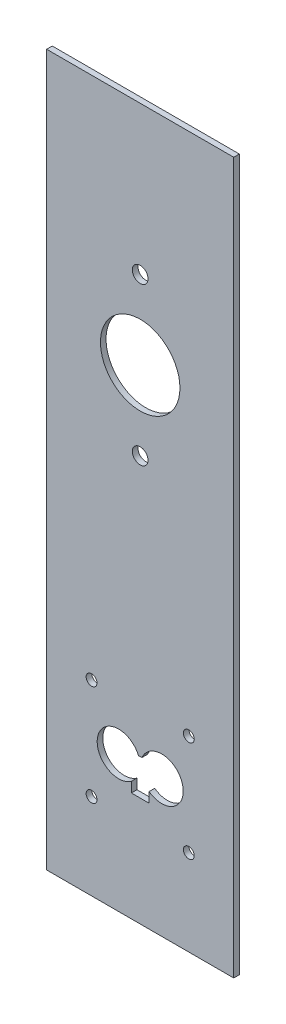
ISO-10303-21;
HEADER;
FILE_DESCRIPTION(('STEP AP214'),'2;1');
FILE_NAME('part.step','',(''),(''),'','','');
FILE_SCHEMA(('AUTOMOTIVE_DESIGN { 1 0 10303 214 1 1 1 1 }'));
ENDSEC;
DATA;
#1=APPLICATION_CONTEXT('core data for automotive mechanical design processes');
#2=APPLICATION_PROTOCOL_DEFINITION('international standard','automotive_design',2000,#1);
#3=PRODUCT_CONTEXT('',#1,'mechanical');
#4=PRODUCT('Part','Part','',(#3));
#5=PRODUCT_RELATED_PRODUCT_CATEGORY('part','',(#4));
#6=PRODUCT_DEFINITION_FORMATION('','',#4);
#7=PRODUCT_DEFINITION_CONTEXT('part definition',#1,'design');
#8=PRODUCT_DEFINITION('design','',#6,#7);
#9=PRODUCT_DEFINITION_SHAPE('','',#8);
#10=(LENGTH_UNIT() NAMED_UNIT(*) SI_UNIT(.MILLI.,.METRE.));
#11=(NAMED_UNIT(*) PLANE_ANGLE_UNIT() SI_UNIT($,.RADIAN.));
#12=(NAMED_UNIT(*) SI_UNIT($,.STERADIAN.) SOLID_ANGLE_UNIT());
#13=UNCERTAINTY_MEASURE_WITH_UNIT(LENGTH_MEASURE(1.E-05),#10,'distance_accuracy_value','');
#14=(GEOMETRIC_REPRESENTATION_CONTEXT(3) GLOBAL_UNCERTAINTY_ASSIGNED_CONTEXT((#13)) GLOBAL_UNIT_ASSIGNED_CONTEXT((#10,
#11,#12)) REPRESENTATION_CONTEXT('',''));
#15=CARTESIAN_POINT('',(0.,0.,0.));
#16=DIRECTION('',(0.,0.,1.));
#17=DIRECTION('',(1.,0.,0.));
#18=AXIS2_PLACEMENT_3D('',#15,#16,#17);
#19=CARTESIAN_POINT('',(0.,0.,-3.));
#20=DIRECTION('',(0.,-1.,0.));
#21=DIRECTION('',(0.,0.,-1.));
#22=AXIS2_PLACEMENT_3D('',#19,#20,#21);
#23=PLANE('',#22);
#24=DIRECTION('',(1.,0.,0.));
#25=VECTOR('',#24,1.);
#26=CARTESIAN_POINT('',(0.,0.,0.));
#27=LINE('',#26,#25);
#28=CARTESIAN_POINT('',(0.,0.,0.));
#29=VERTEX_POINT('',#28);
#30=CARTESIAN_POINT('',(100.,0.,0.));
#31=VERTEX_POINT('',#30);
#32=EDGE_CURVE('E187',#29,#31,#27,.T.);
#33=ORIENTED_EDGE('',*,*,#32,.F.);
#34=DIRECTION('',(0.,0.,1.));
#35=VECTOR('',#34,1.);
#36=CARTESIAN_POINT('',(0.,0.,-3.));
#37=LINE('',#36,#35);
#38=CARTESIAN_POINT('',(0.,0.,-3.));
#39=VERTEX_POINT('',#38);
#40=EDGE_CURVE('E12',#39,#29,#37,.T.);
#41=ORIENTED_EDGE('',*,*,#40,.F.);
#42=DIRECTION('',(1.,0.,0.));
#43=VECTOR('',#42,1.);
#44=CARTESIAN_POINT('',(0.,0.,-3.));
#45=LINE('',#44,#43);
#46=CARTESIAN_POINT('',(100.,0.,-3.));
#47=VERTEX_POINT('',#46);
#48=EDGE_CURVE('E203',#39,#47,#45,.T.);
#49=ORIENTED_EDGE('',*,*,#48,.T.);
#50=DIRECTION('',(0.,0.,1.));
#51=VECTOR('',#50,1.);
#52=CARTESIAN_POINT('',(100.,0.,-3.));
#53=LINE('',#52,#51);
#54=EDGE_CURVE('E40',#47,#31,#53,.T.);
#55=ORIENTED_EDGE('',*,*,#54,.T.);
#56=EDGE_LOOP('',(#33,#41,#49,#55));
#57=FACE_BOUND('',#56,.T.);
#58=ADVANCED_FACE('F37',(#57),#23,.T.);
#59=CARTESIAN_POINT('',(0.,0.,-3.));
#60=DIRECTION('',(1.,0.,0.));
#61=DIRECTION('',(0.,0.,-1.));
#62=AXIS2_PLACEMENT_3D('',#59,#60,#61);
#63=PLANE('',#62);
#64=DIRECTION('',(0.,1.,0.));
#65=VECTOR('',#64,1.);
#66=CARTESIAN_POINT('',(0.,0.,0.));
#67=LINE('',#66,#65);
#68=CARTESIAN_POINT('',(0.,380.,0.));
#69=VERTEX_POINT('',#68);
#70=EDGE_CURVE('E201',#29,#69,#67,.T.);
#71=ORIENTED_EDGE('',*,*,#70,.T.);
#72=DIRECTION('',(0.,0.,1.));
#73=VECTOR('',#72,1.);
#74=CARTESIAN_POINT('',(0.,380.,-3.));
#75=LINE('',#74,#73);
#76=CARTESIAN_POINT('',(0.,380.,-3.));
#77=VERTEX_POINT('',#76);
#78=EDGE_CURVE('E45',#77,#69,#75,.T.);
#79=ORIENTED_EDGE('',*,*,#78,.F.);
#80=DIRECTION('',(0.,1.,0.));
#81=VECTOR('',#80,1.);
#82=CARTESIAN_POINT('',(0.,0.,-3.));
#83=LINE('',#82,#81);
#84=EDGE_CURVE('E193',#39,#77,#83,.T.);
#85=ORIENTED_EDGE('',*,*,#84,.F.);
#86=ORIENTED_EDGE('',*,*,#40,.T.);
#87=EDGE_LOOP('',(#71,#79,#85,#86));
#88=FACE_BOUND('',#87,.T.);
#89=ADVANCED_FACE('F277',(#88),#63,.F.);
#90=CARTESIAN_POINT('',(0.,380.,-3.));
#91=DIRECTION('',(0.,-1.,0.));
#92=DIRECTION('',(0.,0.,-1.));
#93=AXIS2_PLACEMENT_3D('',#90,#91,#92);
#94=PLANE('',#93);
#95=DIRECTION('',(1.,0.,0.));
#96=VECTOR('',#95,1.);
#97=CARTESIAN_POINT('',(0.,380.,0.));
#98=LINE('',#97,#96);
#99=CARTESIAN_POINT('',(100.,380.,0.));
#100=VERTEX_POINT('',#99);
#101=EDGE_CURVE('E198',#69,#100,#98,.T.);
#102=ORIENTED_EDGE('',*,*,#101,.T.);
#103=DIRECTION('',(0.,0.,1.));
#104=VECTOR('',#103,1.);
#105=CARTESIAN_POINT('',(100.,380.,-3.));
#106=LINE('',#105,#104);
#107=CARTESIAN_POINT('',(100.,380.,-3.));
#108=VERTEX_POINT('',#107);
#109=EDGE_CURVE('E206',#108,#100,#106,.T.);
#110=ORIENTED_EDGE('',*,*,#109,.F.);
#111=DIRECTION('',(1.,0.,0.));
#112=VECTOR('',#111,1.);
#113=CARTESIAN_POINT('',(0.,380.,-3.));
#114=LINE('',#113,#112);
#115=EDGE_CURVE('E214',#77,#108,#114,.T.);
#116=ORIENTED_EDGE('',*,*,#115,.F.);
#117=ORIENTED_EDGE('',*,*,#78,.T.);
#118=EDGE_LOOP('',(#102,#110,#116,#117));
#119=FACE_BOUND('',#118,.T.);
#120=ADVANCED_FACE('F281',(#119),#94,.F.);
#121=CARTESIAN_POINT('',(100.,0.,-3.));
#122=DIRECTION('',(1.,0.,0.));
#123=DIRECTION('',(0.,0.,-1.));
#124=AXIS2_PLACEMENT_3D('',#121,#122,#123);
#125=PLANE('',#124);
#126=DIRECTION('',(0.,1.,0.));
#127=VECTOR('',#126,1.);
#128=CARTESIAN_POINT('',(100.,0.,0.));
#129=LINE('',#128,#127);
#130=EDGE_CURVE('E191',#31,#100,#129,.T.);
#131=ORIENTED_EDGE('',*,*,#130,.F.);
#132=ORIENTED_EDGE('',*,*,#54,.F.);
#133=DIRECTION('',(0.,1.,0.));
#134=VECTOR('',#133,1.);
#135=CARTESIAN_POINT('',(100.,0.,-3.));
#136=LINE('',#135,#134);
#137=EDGE_CURVE('E219',#47,#108,#136,.T.);
#138=ORIENTED_EDGE('',*,*,#137,.T.);
#139=ORIENTED_EDGE('',*,*,#109,.T.);
#140=EDGE_LOOP('',(#131,#132,#138,#139));
#141=FACE_BOUND('',#140,.T.);
#142=ADVANCED_FACE('F288',(#141),#125,.T.);
#143=CARTESIAN_POINT('',(0.,0.,-3.));
#144=DIRECTION('',(0.,0.,1.));
#145=DIRECTION('',(1.,0.,0.));
#146=AXIS2_PLACEMENT_3D('',#143,#144,#145);
#147=PLANE('',#146);
#148=CARTESIAN_POINT('',(50.,300.75,-3.));
#149=DIRECTION('',(0.,0.,1.));
#150=DIRECTION('',(1.,0.,0.));
#151=AXIS2_PLACEMENT_3D('',#148,#149,#150);
#152=CIRCLE('',#151,4.19999999999996);
#153=CARTESIAN_POINT('',(54.2,300.75,-3.));
#154=VERTEX_POINT('',#153);
#155=EDGE_CURVE('E192',#154,#154,#152,.T.);
#156=ORIENTED_EDGE('',*,*,#155,.T.);
#157=EDGE_LOOP('',(#156));
#158=FACE_BOUND('',#157,.T.);
#159=DIRECTION('',(1.,0.,0.));
#160=VECTOR('',#159,1.);
#161=CARTESIAN_POINT('',(0.,58.3000000000001,-3.));
#162=LINE('',#161,#160);
#163=CARTESIAN_POINT('',(45.25,58.3,-3.));
#164=VERTEX_POINT('',#163);
#165=CARTESIAN_POINT('',(54.75,58.3000000000001,-3.));
#166=VERTEX_POINT('',#165);
#167=EDGE_CURVE('E228',#164,#166,#162,.T.);
#168=ORIENTED_EDGE('',*,*,#167,.T.);
#169=DIRECTION('',(0.,1.,0.));
#170=VECTOR('',#169,1.);
#171=CARTESIAN_POINT('',(54.75,0.,-3.));
#172=LINE('',#171,#170);
#173=CARTESIAN_POINT('',(54.75,63.689387775232,-3.));
#174=VERTEX_POINT('',#173);
#175=EDGE_CURVE('E117',#166,#174,#172,.T.);
#176=ORIENTED_EDGE('',*,*,#175,.T.);
#177=CARTESIAN_POINT('',(61.5,73.,-3.));
#178=DIRECTION('',(0.,0.,1.));
#179=DIRECTION('',(1.,0.,0.));
#180=AXIS2_PLACEMENT_3D('',#177,#178,#179);
#181=CIRCLE('',#180,11.5);
#182=CARTESIAN_POINT('',(50.9169947557416,77.5,-3.));
#183=VERTEX_POINT('',#182);
#184=EDGE_CURVE('E237',#174,#183,#181,.T.);
#185=ORIENTED_EDGE('',*,*,#184,.T.);
#186=DIRECTION('',(1.,0.,0.));
#187=VECTOR('',#186,1.);
#188=CARTESIAN_POINT('',(0.,77.5,-3.));
#189=LINE('',#188,#187);
#190=CARTESIAN_POINT('',(49.0830052442583,77.5,-3.));
#191=VERTEX_POINT('',#190);
#192=EDGE_CURVE('E235',#191,#183,#189,.T.);
#193=ORIENTED_EDGE('',*,*,#192,.F.);
#194=CARTESIAN_POINT('',(38.5,73.,-3.));
#195=DIRECTION('',(0.,0.,1.));
#196=DIRECTION('',(1.,0.,0.));
#197=AXIS2_PLACEMENT_3D('',#194,#195,#196);
#198=CIRCLE('',#197,11.5);
#199=CARTESIAN_POINT('',(45.25,63.6893877752321,-3.));
#200=VERTEX_POINT('',#199);
#201=EDGE_CURVE('E232',#191,#200,#198,.T.);
#202=ORIENTED_EDGE('',*,*,#201,.T.);
#203=DIRECTION('',(0.,1.,0.));
#204=VECTOR('',#203,1.);
#205=CARTESIAN_POINT('',(45.25,0.,-3.));
#206=LINE('',#205,#204);
#207=EDGE_CURVE('E230',#164,#200,#206,.T.);
#208=ORIENTED_EDGE('',*,*,#207,.F.);
#209=EDGE_LOOP('',(#168,#176,#185,#193,#202,#208));
#210=FACE_BOUND('',#209,.T.);
#211=CARTESIAN_POINT('',(24.,46.0000000000001,-3.));
#212=DIRECTION('',(0.,0.,1.));
#213=DIRECTION('',(1.,0.,0.));
#214=AXIS2_PLACEMENT_3D('',#211,#212,#213);
#215=CIRCLE('',#214,2.89999999999997);
#216=CARTESIAN_POINT('',(26.9,46.0000000000001,-3.));
#217=VERTEX_POINT('',#216);
#218=EDGE_CURVE('E240',#217,#217,#215,.T.);
#219=ORIENTED_EDGE('',*,*,#218,.T.);
#220=EDGE_LOOP('',(#219));
#221=FACE_BOUND('',#220,.T.);
#222=CARTESIAN_POINT('',(76.,100.,-3.));
#223=DIRECTION('',(0.,0.,1.));
#224=DIRECTION('',(1.,0.,0.));
#225=AXIS2_PLACEMENT_3D('',#222,#223,#224);
#226=CIRCLE('',#225,2.89999999999999);
#227=CARTESIAN_POINT('',(78.9,100.,-3.));
#228=VERTEX_POINT('',#227);
#229=EDGE_CURVE('E243',#228,#228,#226,.T.);
#230=ORIENTED_EDGE('',*,*,#229,.T.);
#231=EDGE_LOOP('',(#230));
#232=FACE_BOUND('',#231,.T.);
#233=CARTESIAN_POINT('',(50.,258.75,-3.));
#234=DIRECTION('',(0.,0.,1.));
#235=DIRECTION('',(1.,0.,0.));
#236=AXIS2_PLACEMENT_3D('',#233,#234,#235);
#237=CIRCLE('',#236,21.25);
#238=CARTESIAN_POINT('',(71.25,258.75,-3.));
#239=VERTEX_POINT('',#238);
#240=EDGE_CURVE('E246',#239,#239,#237,.T.);
#241=ORIENTED_EDGE('',*,*,#240,.T.);
#242=EDGE_LOOP('',(#241));
#243=FACE_BOUND('',#242,.T.);
#244=CARTESIAN_POINT('',(50.,216.75,-3.));
#245=DIRECTION('',(0.,0.,1.));
#246=DIRECTION('',(1.,0.,0.));
#247=AXIS2_PLACEMENT_3D('',#244,#245,#246);
#248=CIRCLE('',#247,4.19999999999995);
#249=CARTESIAN_POINT('',(54.2,216.75,-3.));
#250=VERTEX_POINT('',#249);
#251=EDGE_CURVE('E249',#250,#250,#248,.T.);
#252=ORIENTED_EDGE('',*,*,#251,.T.);
#253=EDGE_LOOP('',(#252));
#254=FACE_BOUND('',#253,.T.);
#255=CARTESIAN_POINT('',(76.,46.,-3.));
#256=DIRECTION('',(0.,0.,1.));
#257=DIRECTION('',(1.,0.,0.));
#258=AXIS2_PLACEMENT_3D('',#255,#256,#257);
#259=CIRCLE('',#258,2.9);
#260=CARTESIAN_POINT('',(78.9,46.,-3.));
#261=VERTEX_POINT('',#260);
#262=EDGE_CURVE('E251',#261,#261,#259,.T.);
#263=ORIENTED_EDGE('',*,*,#262,.T.);
#264=EDGE_LOOP('',(#263));
#265=FACE_BOUND('',#264,.T.);
#266=CARTESIAN_POINT('',(24.,100.,-3.));
#267=DIRECTION('',(0.,0.,1.));
#268=DIRECTION('',(1.,0.,0.));
#269=AXIS2_PLACEMENT_3D('',#266,#267,#268);
#270=CIRCLE('',#269,2.89999999999998);
#271=CARTESIAN_POINT('',(26.9,100.,-3.));
#272=VERTEX_POINT('',#271);
#273=EDGE_CURVE('E177',#272,#272,#270,.T.);
#274=ORIENTED_EDGE('',*,*,#273,.T.);
#275=EDGE_LOOP('',(#274));
#276=FACE_BOUND('',#275,.T.);
#277=ORIENTED_EDGE('',*,*,#48,.F.);
#278=ORIENTED_EDGE('',*,*,#84,.T.);
#279=ORIENTED_EDGE('',*,*,#115,.T.);
#280=ORIENTED_EDGE('',*,*,#137,.F.);
#281=EDGE_LOOP('',(#277,#278,#279,#280));
#282=FACE_BOUND('',#281,.T.);
#283=ADVANCED_FACE('F258',(#158,#210,#221,#232,#243,#254,#265,#276,#282),#147,.F.);
#284=CARTESIAN_POINT('',(0.,0.,0.));
#285=DIRECTION('',(0.,0.,1.));
#286=DIRECTION('',(1.,0.,0.));
#287=AXIS2_PLACEMENT_3D('',#284,#285,#286);
#288=PLANE('',#287);
#289=CARTESIAN_POINT('',(50.,300.75,0.));
#290=DIRECTION('',(0.,0.,1.));
#291=DIRECTION('',(1.,0.,0.));
#292=AXIS2_PLACEMENT_3D('',#289,#290,#291);
#293=CIRCLE('',#292,4.19999999999996);
#294=CARTESIAN_POINT('',(54.2,300.75,0.));
#295=VERTEX_POINT('',#294);
#296=EDGE_CURVE('E121',#295,#295,#293,.T.);
#297=ORIENTED_EDGE('',*,*,#296,.F.);
#298=EDGE_LOOP('',(#297));
#299=FACE_BOUND('',#298,.T.);
#300=DIRECTION('',(0.,1.,0.));
#301=VECTOR('',#300,1.);
#302=CARTESIAN_POINT('',(54.75,0.,0.));
#303=LINE('',#302,#301);
#304=CARTESIAN_POINT('',(54.75,58.3000000000001,0.));
#305=VERTEX_POINT('',#304);
#306=CARTESIAN_POINT('',(54.75,63.689387775232,0.));
#307=VERTEX_POINT('',#306);
#308=EDGE_CURVE('E61',#305,#307,#303,.T.);
#309=ORIENTED_EDGE('',*,*,#308,.F.);
#310=DIRECTION('',(1.,0.,0.));
#311=VECTOR('',#310,1.);
#312=CARTESIAN_POINT('',(0.,58.3000000000001,0.));
#313=LINE('',#312,#311);
#314=CARTESIAN_POINT('',(45.25,58.3,0.));
#315=VERTEX_POINT('',#314);
#316=EDGE_CURVE('E124',#315,#305,#313,.T.);
#317=ORIENTED_EDGE('',*,*,#316,.F.);
#318=DIRECTION('',(0.,1.,0.));
#319=VECTOR('',#318,1.);
#320=CARTESIAN_POINT('',(45.25,0.,0.));
#321=LINE('',#320,#319);
#322=CARTESIAN_POINT('',(45.25,63.6893877752321,0.));
#323=VERTEX_POINT('',#322);
#324=EDGE_CURVE('E130',#315,#323,#321,.T.);
#325=ORIENTED_EDGE('',*,*,#324,.T.);
#326=CARTESIAN_POINT('',(38.5,73.,0.));
#327=DIRECTION('',(0.,0.,1.));
#328=DIRECTION('',(1.,0.,0.));
#329=AXIS2_PLACEMENT_3D('',#326,#327,#328);
#330=CIRCLE('',#329,11.5);
#331=CARTESIAN_POINT('',(49.0830052442583,77.5,0.));
#332=VERTEX_POINT('',#331);
#333=EDGE_CURVE('E161',#332,#323,#330,.T.);
#334=ORIENTED_EDGE('',*,*,#333,.F.);
#335=DIRECTION('',(1.,0.,0.));
#336=VECTOR('',#335,1.);
#337=CARTESIAN_POINT('',(0.,77.5,0.));
#338=LINE('',#337,#336);
#339=CARTESIAN_POINT('',(50.9169947557416,77.5,0.));
#340=VERTEX_POINT('',#339);
#341=EDGE_CURVE('E143',#332,#340,#338,.T.);
#342=ORIENTED_EDGE('',*,*,#341,.T.);
#343=CARTESIAN_POINT('',(61.5,73.,0.));
#344=DIRECTION('',(0.,0.,1.));
#345=DIRECTION('',(1.,0.,0.));
#346=AXIS2_PLACEMENT_3D('',#343,#344,#345);
#347=CIRCLE('',#346,11.5);
#348=EDGE_CURVE('E137',#307,#340,#347,.T.);
#349=ORIENTED_EDGE('',*,*,#348,.F.);
#350=EDGE_LOOP('',(#309,#317,#325,#334,#342,#349));
#351=FACE_BOUND('',#350,.T.);
#352=CARTESIAN_POINT('',(24.,46.0000000000001,0.));
#353=DIRECTION('',(0.,0.,1.));
#354=DIRECTION('',(1.,0.,0.));
#355=AXIS2_PLACEMENT_3D('',#352,#353,#354);
#356=CIRCLE('',#355,2.89999999999997);
#357=CARTESIAN_POINT('',(26.9,46.0000000000001,0.));
#358=VERTEX_POINT('',#357);
#359=EDGE_CURVE('E138',#358,#358,#356,.T.);
#360=ORIENTED_EDGE('',*,*,#359,.F.);
#361=EDGE_LOOP('',(#360));
#362=FACE_BOUND('',#361,.T.);
#363=CARTESIAN_POINT('',(76.,100.,0.));
#364=DIRECTION('',(0.,0.,1.));
#365=DIRECTION('',(1.,0.,0.));
#366=AXIS2_PLACEMENT_3D('',#363,#364,#365);
#367=CIRCLE('',#366,2.89999999999999);
#368=CARTESIAN_POINT('',(78.9,100.,0.));
#369=VERTEX_POINT('',#368);
#370=EDGE_CURVE('E141',#369,#369,#367,.T.);
#371=ORIENTED_EDGE('',*,*,#370,.F.);
#372=EDGE_LOOP('',(#371));
#373=FACE_BOUND('',#372,.T.);
#374=CARTESIAN_POINT('',(50.,258.75,0.));
#375=DIRECTION('',(0.,0.,1.));
#376=DIRECTION('',(1.,0.,0.));
#377=AXIS2_PLACEMENT_3D('',#374,#375,#376);
#378=CIRCLE('',#377,21.25);
#379=CARTESIAN_POINT('',(71.25,258.75,0.));
#380=VERTEX_POINT('',#379);
#381=EDGE_CURVE('E437',#380,#380,#378,.T.);
#382=ORIENTED_EDGE('',*,*,#381,.F.);
#383=EDGE_LOOP('',(#382));
#384=FACE_BOUND('',#383,.T.);
#385=CARTESIAN_POINT('',(50.,216.75,0.));
#386=DIRECTION('',(0.,0.,1.));
#387=DIRECTION('',(1.,0.,0.));
#388=AXIS2_PLACEMENT_3D('',#385,#386,#387);
#389=CIRCLE('',#388,4.19999999999995);
#390=CARTESIAN_POINT('',(54.2,216.75,0.));
#391=VERTEX_POINT('',#390);
#392=EDGE_CURVE('E439',#391,#391,#389,.T.);
#393=ORIENTED_EDGE('',*,*,#392,.F.);
#394=EDGE_LOOP('',(#393));
#395=FACE_BOUND('',#394,.T.);
#396=CARTESIAN_POINT('',(76.,46.,0.));
#397=DIRECTION('',(0.,0.,1.));
#398=DIRECTION('',(1.,0.,0.));
#399=AXIS2_PLACEMENT_3D('',#396,#397,#398);
#400=CIRCLE('',#399,2.9);
#401=CARTESIAN_POINT('',(78.9,46.,0.));
#402=VERTEX_POINT('',#401);
#403=EDGE_CURVE('E443',#402,#402,#400,.T.);
#404=ORIENTED_EDGE('',*,*,#403,.F.);
#405=EDGE_LOOP('',(#404));
#406=FACE_BOUND('',#405,.T.);
#407=CARTESIAN_POINT('',(24.,100.,0.));
#408=DIRECTION('',(0.,0.,1.));
#409=DIRECTION('',(1.,0.,0.));
#410=AXIS2_PLACEMENT_3D('',#407,#408,#409);
#411=CIRCLE('',#410,2.89999999999998);
#412=CARTESIAN_POINT('',(26.9,100.,0.));
#413=VERTEX_POINT('',#412);
#414=EDGE_CURVE('E173',#413,#413,#411,.T.);
#415=ORIENTED_EDGE('',*,*,#414,.F.);
#416=EDGE_LOOP('',(#415));
#417=FACE_BOUND('',#416,.T.);
#418=ORIENTED_EDGE('',*,*,#32,.T.);
#419=ORIENTED_EDGE('',*,*,#130,.T.);
#420=ORIENTED_EDGE('',*,*,#101,.F.);
#421=ORIENTED_EDGE('',*,*,#70,.F.);
#422=EDGE_LOOP('',(#418,#419,#420,#421));
#423=FACE_BOUND('',#422,.T.);
#424=ADVANCED_FACE('F134',(#299,#351,#362,#373,#384,#395,#406,#417,#423),#288,.T.);
#425=CARTESIAN_POINT('',(24.,100.,-10.));
#426=DIRECTION('',(0.,0.,1.));
#427=DIRECTION('',(1.,0.,0.));
#428=AXIS2_PLACEMENT_3D('',#425,#426,#427);
#429=CYLINDRICAL_SURFACE('',#428,2.89999999999998);
#430=ORIENTED_EDGE('',*,*,#414,.T.);
#431=EDGE_LOOP('',(#430));
#432=FACE_BOUND('',#431,.T.);
#433=ORIENTED_EDGE('',*,*,#273,.F.);
#434=EDGE_LOOP('',(#433));
#435=FACE_BOUND('',#434,.T.);
#436=ADVANCED_FACE('F260',(#432,#435),#429,.F.);
#437=CARTESIAN_POINT('',(76.,46.,-10.));
#438=DIRECTION('',(0.,0.,1.));
#439=DIRECTION('',(1.,0.,0.));
#440=AXIS2_PLACEMENT_3D('',#437,#438,#439);
#441=CYLINDRICAL_SURFACE('',#440,2.9);
#442=ORIENTED_EDGE('',*,*,#403,.T.);
#443=EDGE_LOOP('',(#442));
#444=FACE_BOUND('',#443,.T.);
#445=ORIENTED_EDGE('',*,*,#262,.F.);
#446=EDGE_LOOP('',(#445));
#447=FACE_BOUND('',#446,.T.);
#448=ADVANCED_FACE('F262',(#444,#447),#441,.F.);
#449=CARTESIAN_POINT('',(50.,216.75,-10.));
#450=DIRECTION('',(0.,0.,1.));
#451=DIRECTION('',(1.,0.,0.));
#452=AXIS2_PLACEMENT_3D('',#449,#450,#451);
#453=CYLINDRICAL_SURFACE('',#452,4.19999999999995);
#454=ORIENTED_EDGE('',*,*,#392,.T.);
#455=EDGE_LOOP('',(#454));
#456=FACE_BOUND('',#455,.T.);
#457=ORIENTED_EDGE('',*,*,#251,.F.);
#458=EDGE_LOOP('',(#457));
#459=FACE_BOUND('',#458,.T.);
#460=ADVANCED_FACE('F269',(#456,#459),#453,.F.);
#461=CARTESIAN_POINT('',(50.,258.75,-10.));
#462=DIRECTION('',(0.,0.,1.));
#463=DIRECTION('',(1.,0.,0.));
#464=AXIS2_PLACEMENT_3D('',#461,#462,#463);
#465=CYLINDRICAL_SURFACE('',#464,21.25);
#466=ORIENTED_EDGE('',*,*,#381,.T.);
#467=EDGE_LOOP('',(#466));
#468=FACE_BOUND('',#467,.T.);
#469=ORIENTED_EDGE('',*,*,#240,.F.);
#470=EDGE_LOOP('',(#469));
#471=FACE_BOUND('',#470,.T.);
#472=ADVANCED_FACE('F334',(#468,#471),#465,.F.);
#473=CARTESIAN_POINT('',(76.,100.,-10.));
#474=DIRECTION('',(0.,0.,1.));
#475=DIRECTION('',(1.,0.,0.));
#476=AXIS2_PLACEMENT_3D('',#473,#474,#475);
#477=CYLINDRICAL_SURFACE('',#476,2.89999999999999);
#478=ORIENTED_EDGE('',*,*,#370,.T.);
#479=EDGE_LOOP('',(#478));
#480=FACE_BOUND('',#479,.T.);
#481=ORIENTED_EDGE('',*,*,#229,.F.);
#482=EDGE_LOOP('',(#481));
#483=FACE_BOUND('',#482,.T.);
#484=ADVANCED_FACE('F344',(#480,#483),#477,.F.);
#485=CARTESIAN_POINT('',(24.,46.0000000000001,-10.));
#486=DIRECTION('',(0.,0.,1.));
#487=DIRECTION('',(1.,0.,0.));
#488=AXIS2_PLACEMENT_3D('',#485,#486,#487);
#489=CYLINDRICAL_SURFACE('',#488,2.89999999999997);
#490=ORIENTED_EDGE('',*,*,#359,.T.);
#491=EDGE_LOOP('',(#490));
#492=FACE_BOUND('',#491,.T.);
#493=ORIENTED_EDGE('',*,*,#218,.F.);
#494=EDGE_LOOP('',(#493));
#495=FACE_BOUND('',#494,.T.);
#496=ADVANCED_FACE('F354',(#492,#495),#489,.F.);
#497=CARTESIAN_POINT('',(54.75,0.,-10.));
#498=DIRECTION('',(1.,0.,0.));
#499=DIRECTION('',(0.,0.,-1.));
#500=AXIS2_PLACEMENT_3D('',#497,#498,#499);
#501=PLANE('',#500);
#502=DIRECTION('',(0.,0.,1.));
#503=VECTOR('',#502,1.);
#504=CARTESIAN_POINT('',(54.75,58.3000000000001,-10.));
#505=LINE('',#504,#503);
#506=EDGE_CURVE('E113',#166,#305,#505,.T.);
#507=ORIENTED_EDGE('',*,*,#506,.T.);
#508=ORIENTED_EDGE('',*,*,#308,.T.);
#509=DIRECTION('',(0.,0.,1.));
#510=VECTOR('',#509,1.);
#511=CARTESIAN_POINT('',(54.75,63.689387775232,-10.));
#512=LINE('',#511,#510);
#513=EDGE_CURVE('E131',#174,#307,#512,.T.);
#514=ORIENTED_EDGE('',*,*,#513,.F.);
#515=ORIENTED_EDGE('',*,*,#175,.F.);
#516=EDGE_LOOP('',(#507,#508,#514,#515));
#517=FACE_BOUND('',#516,.T.);
#518=ADVANCED_FACE('F115',(#517),#501,.F.);
#519=CARTESIAN_POINT('',(0.,58.3000000000001,-10.));
#520=DIRECTION('',(0.,-1.,0.));
#521=DIRECTION('',(1.,0.,0.));
#522=AXIS2_PLACEMENT_3D('',#519,#520,#521);
#523=PLANE('',#522);
#524=DIRECTION('',(0.,0.,1.));
#525=VECTOR('',#524,1.);
#526=CARTESIAN_POINT('',(45.25,58.3,-10.));
#527=LINE('',#526,#525);
#528=EDGE_CURVE('E120',#164,#315,#527,.T.);
#529=ORIENTED_EDGE('',*,*,#528,.T.);
#530=ORIENTED_EDGE('',*,*,#316,.T.);
#531=ORIENTED_EDGE('',*,*,#506,.F.);
#532=ORIENTED_EDGE('',*,*,#167,.F.);
#533=EDGE_LOOP('',(#529,#530,#531,#532));
#534=FACE_BOUND('',#533,.T.);
#535=ADVANCED_FACE('F125',(#534),#523,.F.);
#536=CARTESIAN_POINT('',(45.25,0.,-10.));
#537=DIRECTION('',(1.,0.,0.));
#538=DIRECTION('',(0.,0.,-1.));
#539=AXIS2_PLACEMENT_3D('',#536,#537,#538);
#540=PLANE('',#539);
#541=ORIENTED_EDGE('',*,*,#207,.T.);
#542=DIRECTION('',(0.,0.,1.));
#543=VECTOR('',#542,1.);
#544=CARTESIAN_POINT('',(45.25,63.6893877752321,-10.));
#545=LINE('',#544,#543);
#546=EDGE_CURVE('E454',#200,#323,#545,.T.);
#547=ORIENTED_EDGE('',*,*,#546,.T.);
#548=ORIENTED_EDGE('',*,*,#324,.F.);
#549=ORIENTED_EDGE('',*,*,#528,.F.);
#550=EDGE_LOOP('',(#541,#547,#548,#549));
#551=FACE_BOUND('',#550,.T.);
#552=ADVANCED_FACE('F381',(#551),#540,.T.);
#553=CARTESIAN_POINT('',(38.5,73.,-10.));
#554=DIRECTION('',(0.,0.,1.));
#555=DIRECTION('',(1.,0.,0.));
#556=AXIS2_PLACEMENT_3D('',#553,#554,#555);
#557=CYLINDRICAL_SURFACE('',#556,11.5);
#558=DIRECTION('',(0.,0.,1.));
#559=VECTOR('',#558,1.);
#560=CARTESIAN_POINT('',(49.0830052442583,77.5,-10.));
#561=LINE('',#560,#559);
#562=EDGE_CURVE('E452',#191,#332,#561,.T.);
#563=ORIENTED_EDGE('',*,*,#562,.T.);
#564=ORIENTED_EDGE('',*,*,#333,.T.);
#565=ORIENTED_EDGE('',*,*,#546,.F.);
#566=ORIENTED_EDGE('',*,*,#201,.F.);
#567=EDGE_LOOP('',(#563,#564,#565,#566));
#568=FACE_BOUND('',#567,.T.);
#569=ADVANCED_FACE('F390',(#568),#557,.F.);
#570=CARTESIAN_POINT('',(0.,77.5,-10.));
#571=DIRECTION('',(0.,-1.,0.));
#572=DIRECTION('',(0.,0.,-1.));
#573=AXIS2_PLACEMENT_3D('',#570,#571,#572);
#574=PLANE('',#573);
#575=ORIENTED_EDGE('',*,*,#192,.T.);
#576=DIRECTION('',(0.,0.,1.));
#577=VECTOR('',#576,1.);
#578=CARTESIAN_POINT('',(50.9169947557416,77.5,-10.));
#579=LINE('',#578,#577);
#580=EDGE_CURVE('E53',#183,#340,#579,.T.);
#581=ORIENTED_EDGE('',*,*,#580,.T.);
#582=ORIENTED_EDGE('',*,*,#341,.F.);
#583=ORIENTED_EDGE('',*,*,#562,.F.);
#584=EDGE_LOOP('',(#575,#581,#582,#583));
#585=FACE_BOUND('',#584,.T.);
#586=ADVANCED_FACE('F400',(#585),#574,.T.);
#587=CARTESIAN_POINT('',(61.5,73.,-10.));
#588=DIRECTION('',(0.,0.,1.));
#589=DIRECTION('',(1.,0.,0.));
#590=AXIS2_PLACEMENT_3D('',#587,#588,#589);
#591=CYLINDRICAL_SURFACE('',#590,11.5);
#592=ORIENTED_EDGE('',*,*,#513,.T.);
#593=ORIENTED_EDGE('',*,*,#348,.T.);
#594=ORIENTED_EDGE('',*,*,#580,.F.);
#595=ORIENTED_EDGE('',*,*,#184,.F.);
#596=EDGE_LOOP('',(#592,#593,#594,#595));
#597=FACE_BOUND('',#596,.T.);
#598=ADVANCED_FACE('F410',(#597),#591,.F.);
#599=CARTESIAN_POINT('',(50.,300.75,-10.));
#600=DIRECTION('',(0.,0.,1.));
#601=DIRECTION('',(1.,0.,0.));
#602=AXIS2_PLACEMENT_3D('',#599,#600,#601);
#603=CYLINDRICAL_SURFACE('',#602,4.19999999999996);
#604=ORIENTED_EDGE('',*,*,#296,.T.);
#605=EDGE_LOOP('',(#604));
#606=FACE_BOUND('',#605,.T.);
#607=ORIENTED_EDGE('',*,*,#155,.F.);
#608=EDGE_LOOP('',(#607));
#609=FACE_BOUND('',#608,.T.);
#610=ADVANCED_FACE('F420',(#606,#609),#603,.F.);
#611=CLOSED_SHELL('',(#58,#89,#120,#142,#283,#424,#436,#448,#460,#472,#484,#496,#518,#535,#552,
#569,#586,#598,#610));
#612=MANIFOLD_SOLID_BREP('B2',#611);
#613=ADVANCED_BREP_SHAPE_REPRESENTATION('',(#18,#612),#14);
#614=SHAPE_DEFINITION_REPRESENTATION(#9,#613);
ENDSEC;
END-ISO-10303-21;
